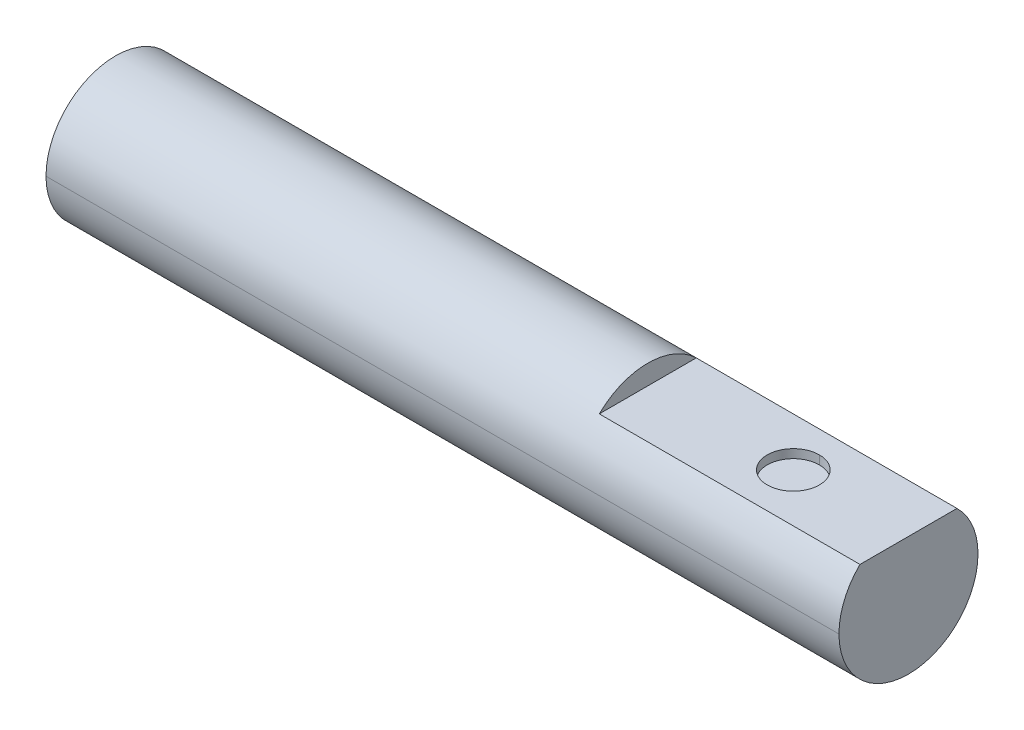
ISO-10303-21;
HEADER;
FILE_DESCRIPTION(('STEP AP214'),'2;1');
FILE_NAME('part.step','',(''),(''),'','','');
FILE_SCHEMA(('AUTOMOTIVE_DESIGN { 1 0 10303 214 1 1 1 1 }'));
ENDSEC;
DATA;
#1=APPLICATION_CONTEXT('core data for automotive mechanical design processes');
#2=APPLICATION_PROTOCOL_DEFINITION('international standard','automotive_design',2000,#1);
#3=PRODUCT_CONTEXT('',#1,'mechanical');
#4=PRODUCT('Part','Part','',(#3));
#5=PRODUCT_RELATED_PRODUCT_CATEGORY('part','',(#4));
#6=PRODUCT_DEFINITION_FORMATION('','',#4);
#7=PRODUCT_DEFINITION_CONTEXT('part definition',#1,'design');
#8=PRODUCT_DEFINITION('design','',#6,#7);
#9=PRODUCT_DEFINITION_SHAPE('','',#8);
#10=(LENGTH_UNIT() NAMED_UNIT(*) SI_UNIT(.MILLI.,.METRE.));
#11=(NAMED_UNIT(*) PLANE_ANGLE_UNIT() SI_UNIT($,.RADIAN.));
#12=(NAMED_UNIT(*) SI_UNIT($,.STERADIAN.) SOLID_ANGLE_UNIT());
#13=UNCERTAINTY_MEASURE_WITH_UNIT(LENGTH_MEASURE(1.E-05),#10,'distance_accuracy_value','');
#14=(GEOMETRIC_REPRESENTATION_CONTEXT(3) GLOBAL_UNCERTAINTY_ASSIGNED_CONTEXT((#13)) GLOBAL_UNIT_ASSIGNED_CONTEXT((#10,
#11,#12)) REPRESENTATION_CONTEXT('',''));
#15=CARTESIAN_POINT('',(0.,0.,0.));
#16=DIRECTION('',(0.,0.,1.));
#17=DIRECTION('',(1.,0.,0.));
#18=AXIS2_PLACEMENT_3D('',#15,#16,#17);
#19=CARTESIAN_POINT('',(31.3730625758342,2.36539523864287,0.));
#20=DIRECTION('',(0.,1.,0.));
#21=DIRECTION('',(0.,0.,-1.));
#22=AXIS2_PLACEMENT_3D('',#19,#20,#21);
#23=CYLINDRICAL_SURFACE('',#22,1.5);
#24=CARTESIAN_POINT('',(31.3730625758342,2.36539523864287,0.));
#25=DIRECTION('',(0.,-1.,0.));
#26=DIRECTION('',(0.,0.,-1.));
#27=AXIS2_PLACEMENT_3D('',#24,#25,#26);
#28=CIRCLE('',#27,1.5);
#29=CARTESIAN_POINT('',(31.3730625758342,2.36539523864287,-1.5));
#30=VERTEX_POINT('',#29);
#31=CARTESIAN_POINT('',(31.3730625758342,2.36539523864287,1.5));
#32=VERTEX_POINT('',#31);
#33=EDGE_CURVE('E129',#30,#32,#28,.T.);
#34=ORIENTED_EDGE('',*,*,#33,.T.);
#35=DIRECTION('',(0.,1.,0.));
#36=VECTOR('',#35,1.);
#37=CARTESIAN_POINT('',(31.3730625758342,2.36539523864287,1.5));
#38=LINE('',#37,#36);
#39=CARTESIAN_POINT('',(31.3730625758342,2.86539523864287,1.5));
#40=VERTEX_POINT('',#39);
#41=EDGE_CURVE('E115',#32,#40,#38,.T.);
#42=ORIENTED_EDGE('',*,*,#41,.T.);
#43=CARTESIAN_POINT('',(31.3730625758342,2.86539523864287,0.));
#44=DIRECTION('',(0.,-1.,0.));
#45=DIRECTION('',(0.,0.,-1.));
#46=AXIS2_PLACEMENT_3D('',#43,#44,#45);
#47=CIRCLE('',#46,1.5);
#48=CARTESIAN_POINT('',(31.3730625758342,2.86539523864287,-1.5));
#49=VERTEX_POINT('',#48);
#50=EDGE_CURVE('E95',#49,#40,#47,.T.);
#51=ORIENTED_EDGE('',*,*,#50,.F.);
#52=DIRECTION('',(0.,1.,0.));
#53=VECTOR('',#52,1.);
#54=CARTESIAN_POINT('',(31.3730625758342,2.36539523864287,-1.5));
#55=LINE('',#54,#53);
#56=EDGE_CURVE('E112',#30,#49,#55,.T.);
#57=ORIENTED_EDGE('',*,*,#56,.F.);
#58=EDGE_LOOP('',(#34,#42,#51,#57));
#59=FACE_BOUND('',#58,.T.);
#60=ADVANCED_FACE('F16',(#59),#23,.F.);
#61=CARTESIAN_POINT('',(-7.62646412867829,0.,0.));
#62=DIRECTION('',(1.,0.,0.));
#63=DIRECTION('',(0.,0.,1.));
#64=AXIS2_PLACEMENT_3D('',#61,#62,#63);
#65=CYLINDRICAL_SURFACE('',#64,4.);
#66=CARTESIAN_POINT('',(-7.62646412867829,0.,0.));
#67=DIRECTION('',(-1.,0.,0.));
#68=DIRECTION('',(0.,0.,1.));
#69=AXIS2_PLACEMENT_3D('',#66,#67,#68);
#70=CIRCLE('',#69,4.);
#71=CARTESIAN_POINT('',(-7.62646412867829,0.,-4.));
#72=VERTEX_POINT('',#71);
#73=CARTESIAN_POINT('',(-7.62646412867829,0.,4.));
#74=VERTEX_POINT('',#73);
#75=EDGE_CURVE('E136',#72,#74,#70,.T.);
#76=ORIENTED_EDGE('',*,*,#75,.F.);
#77=DIRECTION('',(1.,0.,0.));
#78=VECTOR('',#77,1.);
#79=CARTESIAN_POINT('',(-7.62646412867829,0.,-4.));
#80=LINE('',#79,#78);
#81=CARTESIAN_POINT('',(38.,0.,-4.));
#82=VERTEX_POINT('',#81);
#83=EDGE_CURVE('E27',#72,#82,#80,.T.);
#84=ORIENTED_EDGE('',*,*,#83,.T.);
#85=CARTESIAN_POINT('',(38.,0.,0.));
#86=DIRECTION('',(-1.,0.,0.));
#87=DIRECTION('',(0.,0.,1.));
#88=AXIS2_PLACEMENT_3D('',#85,#86,#87);
#89=CIRCLE('',#88,4.);
#90=CARTESIAN_POINT('',(38.,0.,4.));
#91=VERTEX_POINT('',#90);
#92=EDGE_CURVE('E131',#82,#91,#89,.T.);
#93=ORIENTED_EDGE('',*,*,#92,.T.);
#94=DIRECTION('',(1.,0.,0.));
#95=VECTOR('',#94,1.);
#96=CARTESIAN_POINT('',(-7.62646412867829,0.,4.));
#97=LINE('',#96,#95);
#98=EDGE_CURVE('E11',#74,#91,#97,.T.);
#99=ORIENTED_EDGE('',*,*,#98,.F.);
#100=EDGE_LOOP('',(#76,#84,#93,#99));
#101=FACE_BOUND('',#100,.T.);
#102=ADVANCED_FACE('F166',(#101),#65,.T.);
#103=CARTESIAN_POINT('',(-7.62646412867829,0.,0.));
#104=DIRECTION('',(1.,0.,0.));
#105=DIRECTION('',(0.,0.,1.));
#106=AXIS2_PLACEMENT_3D('',#103,#104,#105);
#107=CYLINDRICAL_SURFACE('',#106,4.);
#108=ORIENTED_EDGE('',*,*,#83,.F.);
#109=CARTESIAN_POINT('',(-7.62646412867829,0.,0.));
#110=DIRECTION('',(-1.,0.,0.));
#111=DIRECTION('',(0.,0.,1.));
#112=AXIS2_PLACEMENT_3D('',#109,#110,#111);
#113=CIRCLE('',#112,4.);
#114=EDGE_CURVE('E132',#74,#72,#113,.T.);
#115=ORIENTED_EDGE('',*,*,#114,.F.);
#116=ORIENTED_EDGE('',*,*,#98,.T.);
#117=CARTESIAN_POINT('',(38.,0.,0.));
#118=DIRECTION('',(-1.,0.,0.));
#119=DIRECTION('',(0.,0.,1.));
#120=AXIS2_PLACEMENT_3D('',#117,#118,#119);
#121=CIRCLE('',#120,4.);
#122=CARTESIAN_POINT('',(38.,2.86539523864287,2.79096938828838));
#123=VERTEX_POINT('',#122);
#124=EDGE_CURVE('E89',#91,#123,#121,.T.);
#125=ORIENTED_EDGE('',*,*,#124,.T.);
#126=DIRECTION('',(1.,0.,0.));
#127=VECTOR('',#126,1.);
#128=CARTESIAN_POINT('',(23.,2.86539523864287,2.79096938828838));
#129=LINE('',#128,#127);
#130=CARTESIAN_POINT('',(23.,2.86539523864287,2.79096938828838));
#131=VERTEX_POINT('',#130);
#132=EDGE_CURVE('E20',#131,#123,#129,.T.);
#133=ORIENTED_EDGE('',*,*,#132,.F.);
#134=CARTESIAN_POINT('',(23.,0.,0.));
#135=DIRECTION('',(1.,0.,0.));
#136=DIRECTION('',(0.,0.,1.));
#137=AXIS2_PLACEMENT_3D('',#134,#135,#136);
#138=CIRCLE('',#137,4.);
#139=CARTESIAN_POINT('',(23.,2.86539523864287,-2.79096938828838));
#140=VERTEX_POINT('',#139);
#141=EDGE_CURVE('E86',#140,#131,#138,.T.);
#142=ORIENTED_EDGE('',*,*,#141,.F.);
#143=DIRECTION('',(1.,0.,0.));
#144=VECTOR('',#143,1.);
#145=CARTESIAN_POINT('',(23.,2.86539523864287,-2.79096938828838));
#146=LINE('',#145,#144);
#147=CARTESIAN_POINT('',(38.,2.86539523864287,-2.79096938828838));
#148=VERTEX_POINT('',#147);
#149=EDGE_CURVE('E96',#140,#148,#146,.T.);
#150=ORIENTED_EDGE('',*,*,#149,.T.);
#151=CARTESIAN_POINT('',(38.,0.,0.));
#152=DIRECTION('',(-1.,0.,0.));
#153=DIRECTION('',(0.,0.,1.));
#154=AXIS2_PLACEMENT_3D('',#151,#152,#153);
#155=CIRCLE('',#154,4.);
#156=EDGE_CURVE('E137',#148,#82,#155,.T.);
#157=ORIENTED_EDGE('',*,*,#156,.T.);
#158=EDGE_LOOP('',(#108,#115,#116,#125,#133,#142,#150,#157));
#159=FACE_BOUND('',#158,.T.);
#160=ADVANCED_FACE('F84',(#159),#107,.T.);
#161=CARTESIAN_POINT('',(-7.62646412867829,0.,0.));
#162=DIRECTION('',(1.,0.,0.));
#163=DIRECTION('',(0.,1.,0.));
#164=AXIS2_PLACEMENT_3D('',#161,#162,#163);
#165=PLANE('',#164);
#166=ORIENTED_EDGE('',*,*,#114,.T.);
#167=ORIENTED_EDGE('',*,*,#75,.T.);
#168=EDGE_LOOP('',(#166,#167));
#169=FACE_BOUND('',#168,.T.);
#170=ADVANCED_FACE('F18',(#169),#165,.F.);
#171=CARTESIAN_POINT('',(38.,0.,0.));
#172=DIRECTION('',(1.,0.,0.));
#173=DIRECTION('',(0.,1.,0.));
#174=AXIS2_PLACEMENT_3D('',#171,#172,#173);
#175=PLANE('',#174);
#176=DIRECTION('',(0.,0.,1.));
#177=VECTOR('',#176,1.);
#178=CARTESIAN_POINT('',(38.,2.86539523864287,-2.79096938828838));
#179=LINE('',#178,#177);
#180=EDGE_CURVE('E101',#148,#123,#179,.T.);
#181=ORIENTED_EDGE('',*,*,#180,.T.);
#182=ORIENTED_EDGE('',*,*,#124,.F.);
#183=ORIENTED_EDGE('',*,*,#92,.F.);
#184=ORIENTED_EDGE('',*,*,#156,.F.);
#185=EDGE_LOOP('',(#181,#182,#183,#184));
#186=FACE_BOUND('',#185,.T.);
#187=ADVANCED_FACE('F173',(#186),#175,.T.);
#188=CARTESIAN_POINT('',(23.,2.86539523864287,-2.79096938828838));
#189=DIRECTION('',(0.,-1.,0.));
#190=DIRECTION('',(0.,0.,-1.));
#191=AXIS2_PLACEMENT_3D('',#188,#189,#190);
#192=PLANE('',#191);
#193=ORIENTED_EDGE('',*,*,#50,.T.);
#194=CARTESIAN_POINT('',(31.3730625758342,2.86539523864287,0.));
#195=DIRECTION('',(0.,-1.,0.));
#196=DIRECTION('',(0.,0.,-1.));
#197=AXIS2_PLACEMENT_3D('',#194,#195,#196);
#198=CIRCLE('',#197,1.5);
#199=EDGE_CURVE('E105',#40,#49,#198,.T.);
#200=ORIENTED_EDGE('',*,*,#199,.T.);
#201=EDGE_LOOP('',(#193,#200));
#202=FACE_BOUND('',#201,.T.);
#203=ORIENTED_EDGE('',*,*,#180,.F.);
#204=ORIENTED_EDGE('',*,*,#149,.F.);
#205=DIRECTION('',(0.,0.,1.));
#206=VECTOR('',#205,1.);
#207=CARTESIAN_POINT('',(23.,2.86539523864287,-2.79096938828838));
#208=LINE('',#207,#206);
#209=EDGE_CURVE('E99',#140,#131,#208,.T.);
#210=ORIENTED_EDGE('',*,*,#209,.T.);
#211=ORIENTED_EDGE('',*,*,#132,.T.);
#212=EDGE_LOOP('',(#203,#204,#210,#211));
#213=FACE_BOUND('',#212,.T.);
#214=ADVANCED_FACE('F103',(#202,#213),#192,.F.);
#215=CARTESIAN_POINT('',(23.,2.86539523864287,-2.79096938828838));
#216=DIRECTION('',(1.,0.,0.));
#217=DIRECTION('',(0.,1.,0.));
#218=AXIS2_PLACEMENT_3D('',#215,#216,#217);
#219=PLANE('',#218);
#220=ORIENTED_EDGE('',*,*,#209,.F.);
#221=ORIENTED_EDGE('',*,*,#141,.T.);
#222=EDGE_LOOP('',(#220,#221));
#223=FACE_BOUND('',#222,.T.);
#224=ADVANCED_FACE('F98',(#223),#219,.T.);
#225=CARTESIAN_POINT('',(31.3730625758342,2.36539523864287,0.));
#226=DIRECTION('',(0.,1.,0.));
#227=DIRECTION('',(0.,0.,-1.));
#228=AXIS2_PLACEMENT_3D('',#225,#226,#227);
#229=CYLINDRICAL_SURFACE('',#228,1.5);
#230=ORIENTED_EDGE('',*,*,#41,.F.);
#231=CARTESIAN_POINT('',(31.3730625758342,2.36539523864287,0.));
#232=DIRECTION('',(0.,-1.,0.));
#233=DIRECTION('',(0.,0.,-1.));
#234=AXIS2_PLACEMENT_3D('',#231,#232,#233);
#235=CIRCLE('',#234,1.5);
#236=EDGE_CURVE('E139',#32,#30,#235,.T.);
#237=ORIENTED_EDGE('',*,*,#236,.T.);
#238=ORIENTED_EDGE('',*,*,#56,.T.);
#239=ORIENTED_EDGE('',*,*,#199,.F.);
#240=EDGE_LOOP('',(#230,#237,#238,#239));
#241=FACE_BOUND('',#240,.T.);
#242=ADVANCED_FACE('F157',(#241),#229,.F.);
#243=CARTESIAN_POINT('',(31.3730625758342,2.36539523864287,0.));
#244=DIRECTION('',(0.,1.,0.));
#245=DIRECTION('',(1.,0.,0.));
#246=AXIS2_PLACEMENT_3D('',#243,#244,#245);
#247=PLANE('',#246);
#248=ORIENTED_EDGE('',*,*,#33,.F.);
#249=ORIENTED_EDGE('',*,*,#236,.F.);
#250=EDGE_LOOP('',(#248,#249));
#251=FACE_BOUND('',#250,.T.);
#252=ADVANCED_FACE('F155',(#251),#247,.T.);
#253=CLOSED_SHELL('',(#60,#102,#160,#170,#187,#214,#224,#242,#252));
#254=MANIFOLD_SOLID_BREP('B1',#253);
#255=ADVANCED_BREP_SHAPE_REPRESENTATION('',(#18,#254),#14);
#256=SHAPE_DEFINITION_REPRESENTATION(#9,#255);
ENDSEC;
END-ISO-10303-21;
